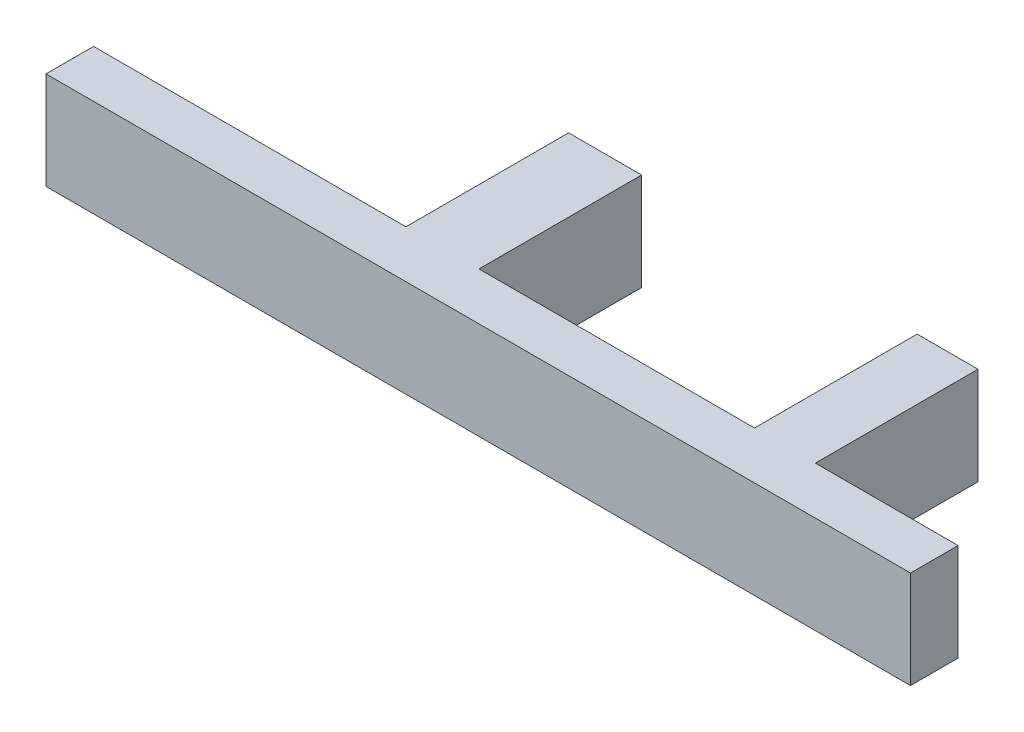
ISO-10303-21;
HEADER;
FILE_DESCRIPTION(('STEP AP214'),'2;1');
FILE_NAME('part.step','',(''),(''),'','','');
FILE_SCHEMA(('AUTOMOTIVE_DESIGN { 1 0 10303 214 1 1 1 1 }'));
ENDSEC;
DATA;
#1=APPLICATION_CONTEXT('core data for automotive mechanical design processes');
#2=APPLICATION_PROTOCOL_DEFINITION('international standard','automotive_design',2000,#1);
#3=PRODUCT_CONTEXT('',#1,'mechanical');
#4=PRODUCT('Part','Part','',(#3));
#5=PRODUCT_RELATED_PRODUCT_CATEGORY('part','',(#4));
#6=PRODUCT_DEFINITION_FORMATION('','',#4);
#7=PRODUCT_DEFINITION_CONTEXT('part definition',#1,'design');
#8=PRODUCT_DEFINITION('design','',#6,#7);
#9=PRODUCT_DEFINITION_SHAPE('','',#8);
#10=(LENGTH_UNIT() NAMED_UNIT(*) SI_UNIT(.MILLI.,.METRE.));
#11=(NAMED_UNIT(*) PLANE_ANGLE_UNIT() SI_UNIT($,.RADIAN.));
#12=(NAMED_UNIT(*) SI_UNIT($,.STERADIAN.) SOLID_ANGLE_UNIT());
#13=UNCERTAINTY_MEASURE_WITH_UNIT(LENGTH_MEASURE(1.E-05),#10,'distance_accuracy_value','');
#14=(GEOMETRIC_REPRESENTATION_CONTEXT(3) GLOBAL_UNCERTAINTY_ASSIGNED_CONTEXT((#13)) GLOBAL_UNIT_ASSIGNED_CONTEXT((#10,
#11,#12)) REPRESENTATION_CONTEXT('',''));
#15=CARTESIAN_POINT('',(0.,0.,0.));
#16=DIRECTION('',(0.,0.,1.));
#17=DIRECTION('',(1.,0.,0.));
#18=AXIS2_PLACEMENT_3D('',#15,#16,#17);
#19=CARTESIAN_POINT('',(12.0137766691168,1.,-14.303194592097));
#20=DIRECTION('',(0.,0.,1.));
#21=DIRECTION('',(1.,0.,0.));
#22=AXIS2_PLACEMENT_3D('',#19,#20,#21);
#23=PLANE('',#22);
#24=DIRECTION('',(-1.,0.,0.));
#25=VECTOR('',#24,1.);
#26=CARTESIAN_POINT('',(12.0137766691168,0.,-14.303194592097));
#27=LINE('',#26,#25);
#28=CARTESIAN_POINT('',(12.0137766691168,0.,-14.303194592097));
#29=VERTEX_POINT('',#28);
#30=CARTESIAN_POINT('',(10.5497617712563,0.,-14.303194592097));
#31=VERTEX_POINT('',#30);
#32=EDGE_CURVE('E11',#29,#31,#27,.T.);
#33=ORIENTED_EDGE('',*,*,#32,.T.);
#34=DIRECTION('',(0.,-1.,0.));
#35=VECTOR('',#34,1.);
#36=CARTESIAN_POINT('',(10.5497617712563,1.,-14.303194592097));
#37=LINE('',#36,#35);
#38=CARTESIAN_POINT('',(10.5497617712563,1.,-14.303194592097));
#39=VERTEX_POINT('',#38);
#40=EDGE_CURVE('E255',#39,#31,#37,.T.);
#41=ORIENTED_EDGE('',*,*,#40,.F.);
#42=DIRECTION('',(-1.,0.,0.));
#43=VECTOR('',#42,1.);
#44=CARTESIAN_POINT('',(12.0137766691168,1.,-14.303194592097));
#45=LINE('',#44,#43);
#46=CARTESIAN_POINT('',(12.0137766691168,1.,-14.303194592097));
#47=VERTEX_POINT('',#46);
#48=EDGE_CURVE('E43',#47,#39,#45,.T.);
#49=ORIENTED_EDGE('',*,*,#48,.F.);
#50=DIRECTION('',(0.,-1.,0.));
#51=VECTOR('',#50,1.);
#52=CARTESIAN_POINT('',(12.0137766691168,1.,-14.303194592097));
#53=LINE('',#52,#51);
#54=EDGE_CURVE('E167',#47,#29,#53,.T.);
#55=ORIENTED_EDGE('',*,*,#54,.T.);
#56=EDGE_LOOP('',(#33,#41,#49,#55));
#57=FACE_BOUND('',#56,.T.);
#58=ADVANCED_FACE('F39',(#57),#23,.F.);
#59=CARTESIAN_POINT('',(10.5497617712563,1.,-14.303194592097));
#60=DIRECTION('',(-1.,0.,0.));
#61=DIRECTION('',(0.,0.,1.));
#62=AXIS2_PLACEMENT_3D('',#59,#60,#61);
#63=PLANE('',#62);
#64=DIRECTION('',(0.,0.,-1.));
#65=VECTOR('',#64,1.);
#66=CARTESIAN_POINT('',(10.5497617712563,0.,-14.303194592097));
#67=LINE('',#66,#65);
#68=CARTESIAN_POINT('',(10.5497617712563,0.,-15.9714906384962));
#69=VERTEX_POINT('',#68);
#70=EDGE_CURVE('E49',#31,#69,#67,.T.);
#71=ORIENTED_EDGE('',*,*,#70,.T.);
#72=DIRECTION('',(0.,-1.,0.));
#73=VECTOR('',#72,1.);
#74=CARTESIAN_POINT('',(10.5497617712563,1.,-15.9714906384962));
#75=LINE('',#74,#73);
#76=CARTESIAN_POINT('',(10.5497617712563,1.,-15.9714906384962));
#77=VERTEX_POINT('',#76);
#78=EDGE_CURVE('E143',#77,#69,#75,.T.);
#79=ORIENTED_EDGE('',*,*,#78,.F.);
#80=DIRECTION('',(0.,0.,-1.));
#81=VECTOR('',#80,1.);
#82=CARTESIAN_POINT('',(10.5497617712563,1.,-14.303194592097));
#83=LINE('',#82,#81);
#84=EDGE_CURVE('E97',#39,#77,#83,.T.);
#85=ORIENTED_EDGE('',*,*,#84,.F.);
#86=ORIENTED_EDGE('',*,*,#40,.T.);
#87=EDGE_LOOP('',(#71,#79,#85,#86));
#88=FACE_BOUND('',#87,.T.);
#89=ADVANCED_FACE('F256',(#88),#63,.F.);
#90=CARTESIAN_POINT('',(10.5497617712563,1.,-15.9714906384962));
#91=DIRECTION('',(0.,0.,1.));
#92=DIRECTION('',(1.,0.,0.));
#93=AXIS2_PLACEMENT_3D('',#90,#91,#92);
#94=PLANE('',#93);
#95=DIRECTION('',(-1.,0.,0.));
#96=VECTOR('',#95,1.);
#97=CARTESIAN_POINT('',(10.5497617712563,0.,-15.9714906384962));
#98=LINE('',#97,#96);
#99=CARTESIAN_POINT('',(9.92556937294369,0.,-15.9714906384962));
#100=VERTEX_POINT('',#99);
#101=EDGE_CURVE('E137',#69,#100,#98,.T.);
#102=ORIENTED_EDGE('',*,*,#101,.T.);
#103=DIRECTION('',(0.,-1.,0.));
#104=VECTOR('',#103,1.);
#105=CARTESIAN_POINT('',(9.92556937294369,1.,-15.9714906384962));
#106=LINE('',#105,#104);
#107=CARTESIAN_POINT('',(9.92556937294369,1.,-15.9714906384962));
#108=VERTEX_POINT('',#107);
#109=EDGE_CURVE('E141',#108,#100,#106,.T.);
#110=ORIENTED_EDGE('',*,*,#109,.F.);
#111=DIRECTION('',(-1.,0.,0.));
#112=VECTOR('',#111,1.);
#113=CARTESIAN_POINT('',(10.5497617712563,1.,-15.9714906384962));
#114=LINE('',#113,#112);
#115=EDGE_CURVE('E182',#77,#108,#114,.T.);
#116=ORIENTED_EDGE('',*,*,#115,.F.);
#117=ORIENTED_EDGE('',*,*,#78,.T.);
#118=EDGE_LOOP('',(#102,#110,#116,#117));
#119=FACE_BOUND('',#118,.T.);
#120=ADVANCED_FACE('F139',(#119),#94,.F.);
#121=CARTESIAN_POINT('',(9.92556937294369,1.,-15.9714906384962));
#122=DIRECTION('',(1.,0.,0.));
#123=DIRECTION('',(0.,0.,-1.));
#124=AXIS2_PLACEMENT_3D('',#121,#122,#123);
#125=PLANE('',#124);
#126=DIRECTION('',(0.,0.,1.));
#127=VECTOR('',#126,1.);
#128=CARTESIAN_POINT('',(9.92556937294369,0.,-15.9714906384962));
#129=LINE('',#128,#127);
#130=CARTESIAN_POINT('',(9.92556937294369,0.,-14.303194592097));
#131=VERTEX_POINT('',#130);
#132=EDGE_CURVE('E145',#100,#131,#129,.T.);
#133=ORIENTED_EDGE('',*,*,#132,.T.);
#134=DIRECTION('',(0.,-1.,0.));
#135=VECTOR('',#134,1.);
#136=CARTESIAN_POINT('',(9.92556937294369,1.,-14.303194592097));
#137=LINE('',#136,#135);
#138=CARTESIAN_POINT('',(9.92556937294369,1.,-14.303194592097));
#139=VERTEX_POINT('',#138);
#140=EDGE_CURVE('E152',#139,#131,#137,.T.);
#141=ORIENTED_EDGE('',*,*,#140,.F.);
#142=DIRECTION('',(0.,0.,1.));
#143=VECTOR('',#142,1.);
#144=CARTESIAN_POINT('',(9.92556937294369,1.,-15.9714906384962));
#145=LINE('',#144,#143);
#146=EDGE_CURVE('E151',#108,#139,#145,.T.);
#147=ORIENTED_EDGE('',*,*,#146,.F.);
#148=ORIENTED_EDGE('',*,*,#109,.T.);
#149=EDGE_LOOP('',(#133,#141,#147,#148));
#150=FACE_BOUND('',#149,.T.);
#151=ADVANCED_FACE('F148',(#150),#125,.F.);
#152=CARTESIAN_POINT('',(9.92556937294369,1.,-14.303194592097));
#153=DIRECTION('',(0.,0.,1.));
#154=DIRECTION('',(1.,0.,0.));
#155=AXIS2_PLACEMENT_3D('',#152,#153,#154);
#156=PLANE('',#155);
#157=DIRECTION('',(-1.,0.,0.));
#158=VECTOR('',#157,1.);
#159=CARTESIAN_POINT('',(9.92556937294369,0.,-14.303194592097));
#160=LINE('',#159,#158);
#161=CARTESIAN_POINT('',(7.09968015149203,0.,-14.303194592097));
#162=VERTEX_POINT('',#161);
#163=EDGE_CURVE('E157',#131,#162,#160,.T.);
#164=ORIENTED_EDGE('',*,*,#163,.T.);
#165=DIRECTION('',(0.,-1.,0.));
#166=VECTOR('',#165,1.);
#167=CARTESIAN_POINT('',(7.09968015149203,1.,-14.303194592097));
#168=LINE('',#167,#166);
#169=CARTESIAN_POINT('',(7.09968015149203,1.,-14.303194592097));
#170=VERTEX_POINT('',#169);
#171=EDGE_CURVE('E207',#170,#162,#168,.T.);
#172=ORIENTED_EDGE('',*,*,#171,.F.);
#173=DIRECTION('',(-1.,0.,0.));
#174=VECTOR('',#173,1.);
#175=CARTESIAN_POINT('',(9.92556937294369,1.,-14.303194592097));
#176=LINE('',#175,#174);
#177=EDGE_CURVE('E179',#139,#170,#176,.T.);
#178=ORIENTED_EDGE('',*,*,#177,.F.);
#179=ORIENTED_EDGE('',*,*,#140,.T.);
#180=EDGE_LOOP('',(#164,#172,#178,#179));
#181=FACE_BOUND('',#180,.T.);
#182=ADVANCED_FACE('F250',(#181),#156,.F.);
#183=CARTESIAN_POINT('',(7.09968015149203,1.,-14.303194592097));
#184=DIRECTION('',(-1.,0.,0.));
#185=DIRECTION('',(0.,0.,1.));
#186=AXIS2_PLACEMENT_3D('',#183,#184,#185);
#187=PLANE('',#186);
#188=DIRECTION('',(0.,0.,-1.));
#189=VECTOR('',#188,1.);
#190=CARTESIAN_POINT('',(7.09968015149203,0.,-14.303194592097));
#191=LINE('',#190,#189);
#192=CARTESIAN_POINT('',(7.09968015149203,0.,-15.9714906384962));
#193=VERTEX_POINT('',#192);
#194=EDGE_CURVE('E159',#162,#193,#191,.T.);
#195=ORIENTED_EDGE('',*,*,#194,.T.);
#196=DIRECTION('',(0.,-1.,0.));
#197=VECTOR('',#196,1.);
#198=CARTESIAN_POINT('',(7.09968015149203,1.,-15.9714906384962));
#199=LINE('',#198,#197);
#200=CARTESIAN_POINT('',(7.09968015149203,1.,-15.9714906384962));
#201=VERTEX_POINT('',#200);
#202=EDGE_CURVE('E204',#201,#193,#199,.T.);
#203=ORIENTED_EDGE('',*,*,#202,.F.);
#204=DIRECTION('',(0.,0.,-1.));
#205=VECTOR('',#204,1.);
#206=CARTESIAN_POINT('',(7.09968015149203,1.,-14.303194592097));
#207=LINE('',#206,#205);
#208=EDGE_CURVE('E177',#170,#201,#207,.T.);
#209=ORIENTED_EDGE('',*,*,#208,.F.);
#210=ORIENTED_EDGE('',*,*,#171,.T.);
#211=EDGE_LOOP('',(#195,#203,#209,#210));
#212=FACE_BOUND('',#211,.T.);
#213=ADVANCED_FACE('F202',(#212),#187,.F.);
#214=CARTESIAN_POINT('',(7.09968015149203,1.,-15.9714906384962));
#215=DIRECTION('',(0.,0.,1.));
#216=DIRECTION('',(1.,0.,0.));
#217=AXIS2_PLACEMENT_3D('',#214,#215,#216);
#218=PLANE('',#217);
#219=DIRECTION('',(-1.,0.,0.));
#220=VECTOR('',#219,1.);
#221=CARTESIAN_POINT('',(7.09968015149203,0.,-15.9714906384962));
#222=LINE('',#221,#220);
#223=CARTESIAN_POINT('',(6.35064927351689,0.,-15.9714906384962));
#224=VERTEX_POINT('',#223);
#225=EDGE_CURVE('E197',#193,#224,#222,.T.);
#226=ORIENTED_EDGE('',*,*,#225,.T.);
#227=DIRECTION('',(0.,-1.,0.));
#228=VECTOR('',#227,1.);
#229=CARTESIAN_POINT('',(6.35064927351689,1.,-15.9714906384962));
#230=LINE('',#229,#228);
#231=CARTESIAN_POINT('',(6.35064927351689,1.,-15.9714906384962));
#232=VERTEX_POINT('',#231);
#233=EDGE_CURVE('E213',#232,#224,#230,.T.);
#234=ORIENTED_EDGE('',*,*,#233,.F.);
#235=DIRECTION('',(-1.,0.,0.));
#236=VECTOR('',#235,1.);
#237=CARTESIAN_POINT('',(7.09968015149203,1.,-15.9714906384962));
#238=LINE('',#237,#236);
#239=EDGE_CURVE('E175',#201,#232,#238,.T.);
#240=ORIENTED_EDGE('',*,*,#239,.F.);
#241=ORIENTED_EDGE('',*,*,#202,.T.);
#242=EDGE_LOOP('',(#226,#234,#240,#241));
#243=FACE_BOUND('',#242,.T.);
#244=ADVANCED_FACE('F210',(#243),#218,.F.);
#245=CARTESIAN_POINT('',(6.35064927351689,1.,-15.9714906384962));
#246=DIRECTION('',(1.,0.,0.));
#247=DIRECTION('',(0.,0.,-1.));
#248=AXIS2_PLACEMENT_3D('',#245,#246,#247);
#249=PLANE('',#248);
#250=DIRECTION('',(0.,0.,1.));
#251=VECTOR('',#250,1.);
#252=CARTESIAN_POINT('',(6.35064927351689,0.,-15.9714906384962));
#253=LINE('',#252,#251);
#254=CARTESIAN_POINT('',(6.35064927351689,0.,-14.303194592097));
#255=VERTEX_POINT('',#254);
#256=EDGE_CURVE('E195',#224,#255,#253,.T.);
#257=ORIENTED_EDGE('',*,*,#256,.T.);
#258=DIRECTION('',(0.,-1.,0.));
#259=VECTOR('',#258,1.);
#260=CARTESIAN_POINT('',(6.35064927351689,1.,-14.303194592097));
#261=LINE('',#260,#259);
#262=CARTESIAN_POINT('',(6.35064927351689,1.,-14.303194592097));
#263=VERTEX_POINT('',#262);
#264=EDGE_CURVE('E223',#263,#255,#261,.T.);
#265=ORIENTED_EDGE('',*,*,#264,.F.);
#266=DIRECTION('',(0.,0.,1.));
#267=VECTOR('',#266,1.);
#268=CARTESIAN_POINT('',(6.35064927351689,1.,-15.9714906384962));
#269=LINE('',#268,#267);
#270=EDGE_CURVE('E173',#232,#263,#269,.T.);
#271=ORIENTED_EDGE('',*,*,#270,.F.);
#272=ORIENTED_EDGE('',*,*,#233,.T.);
#273=EDGE_LOOP('',(#257,#265,#271,#272));
#274=FACE_BOUND('',#273,.T.);
#275=ADVANCED_FACE('F221',(#274),#249,.F.);
#276=CARTESIAN_POINT('',(6.35064927351689,1.,-14.303194592097));
#277=DIRECTION('',(0.,0.,1.));
#278=DIRECTION('',(1.,0.,0.));
#279=AXIS2_PLACEMENT_3D('',#276,#277,#278);
#280=PLANE('',#279);
#281=DIRECTION('',(-1.,0.,0.));
#282=VECTOR('',#281,1.);
#283=CARTESIAN_POINT('',(6.35064927351689,0.,-14.303194592097));
#284=LINE('',#283,#282);
#285=CARTESIAN_POINT('',(3.14682612178813,0.,-14.303194592097));
#286=VERTEX_POINT('',#285);
#287=EDGE_CURVE('E193',#255,#286,#284,.T.);
#288=ORIENTED_EDGE('',*,*,#287,.T.);
#289=DIRECTION('',(0.,-1.,0.));
#290=VECTOR('',#289,1.);
#291=CARTESIAN_POINT('',(3.14682612178813,1.,-14.303194592097));
#292=LINE('',#291,#290);
#293=CARTESIAN_POINT('',(3.14682612178813,1.,-14.303194592097));
#294=VERTEX_POINT('',#293);
#295=EDGE_CURVE('E229',#294,#286,#292,.T.);
#296=ORIENTED_EDGE('',*,*,#295,.F.);
#297=DIRECTION('',(-1.,0.,0.));
#298=VECTOR('',#297,1.);
#299=CARTESIAN_POINT('',(6.35064927351689,1.,-14.303194592097));
#300=LINE('',#299,#298);
#301=EDGE_CURVE('E171',#263,#294,#300,.T.);
#302=ORIENTED_EDGE('',*,*,#301,.F.);
#303=ORIENTED_EDGE('',*,*,#264,.T.);
#304=EDGE_LOOP('',(#288,#296,#302,#303));
#305=FACE_BOUND('',#304,.T.);
#306=ADVANCED_FACE('F226',(#305),#280,.F.);
#307=CARTESIAN_POINT('',(3.14682612178813,1.,-14.303194592097));
#308=DIRECTION('',(1.,0.,0.));
#309=DIRECTION('',(0.,0.,-1.));
#310=AXIS2_PLACEMENT_3D('',#307,#308,#309);
#311=PLANE('',#310);
#312=DIRECTION('',(0.,0.,1.));
#313=VECTOR('',#312,1.);
#314=CARTESIAN_POINT('',(3.14682612178813,0.,-14.303194592097));
#315=LINE('',#314,#313);
#316=CARTESIAN_POINT('',(3.14682612178813,0.,-13.8151896261435));
#317=VERTEX_POINT('',#316);
#318=EDGE_CURVE('E187',#286,#317,#315,.T.);
#319=ORIENTED_EDGE('',*,*,#318,.T.);
#320=DIRECTION('',(0.,-1.,0.));
#321=VECTOR('',#320,1.);
#322=CARTESIAN_POINT('',(3.14682612178813,1.,-13.8151896261435));
#323=LINE('',#322,#321);
#324=CARTESIAN_POINT('',(3.14682612178813,1.,-13.8151896261435));
#325=VERTEX_POINT('',#324);
#326=EDGE_CURVE('E231',#325,#317,#323,.T.);
#327=ORIENTED_EDGE('',*,*,#326,.F.);
#328=DIRECTION('',(0.,0.,1.));
#329=VECTOR('',#328,1.);
#330=CARTESIAN_POINT('',(3.14682612178813,1.,-14.303194592097));
#331=LINE('',#330,#329);
#332=EDGE_CURVE('E169',#294,#325,#331,.T.);
#333=ORIENTED_EDGE('',*,*,#332,.F.);
#334=ORIENTED_EDGE('',*,*,#295,.T.);
#335=EDGE_LOOP('',(#319,#327,#333,#334));
#336=FACE_BOUND('',#335,.T.);
#337=ADVANCED_FACE('F247',(#336),#311,.F.);
#338=CARTESIAN_POINT('',(3.14682612178813,1.,-13.8151896261435));
#339=DIRECTION('',(0.,0.,-1.));
#340=DIRECTION('',(-1.,0.,0.));
#341=AXIS2_PLACEMENT_3D('',#338,#339,#340);
#342=PLANE('',#341);
#343=DIRECTION('',(1.,0.,0.));
#344=VECTOR('',#343,1.);
#345=CARTESIAN_POINT('',(3.14682612178813,0.,-13.8151896261435));
#346=LINE('',#345,#344);
#347=CARTESIAN_POINT('',(12.0137766691168,0.,-13.8151896261435));
#348=VERTEX_POINT('',#347);
#349=EDGE_CURVE('E185',#317,#348,#346,.T.);
#350=ORIENTED_EDGE('',*,*,#349,.T.);
#351=DIRECTION('',(0.,-1.,0.));
#352=VECTOR('',#351,1.);
#353=CARTESIAN_POINT('',(12.0137766691168,1.,-13.8151896261435));
#354=LINE('',#353,#352);
#355=CARTESIAN_POINT('',(12.0137766691168,1.,-13.8151896261435));
#356=VERTEX_POINT('',#355);
#357=EDGE_CURVE('E236',#356,#348,#354,.T.);
#358=ORIENTED_EDGE('',*,*,#357,.F.);
#359=DIRECTION('',(1.,0.,0.));
#360=VECTOR('',#359,1.);
#361=CARTESIAN_POINT('',(3.14682612178813,1.,-13.8151896261435));
#362=LINE('',#361,#360);
#363=EDGE_CURVE('E166',#325,#356,#362,.T.);
#364=ORIENTED_EDGE('',*,*,#363,.F.);
#365=ORIENTED_EDGE('',*,*,#326,.T.);
#366=EDGE_LOOP('',(#350,#358,#364,#365));
#367=FACE_BOUND('',#366,.T.);
#368=ADVANCED_FACE('F242',(#367),#342,.F.);
#369=CARTESIAN_POINT('',(12.0137766691168,1.,-13.8151896261435));
#370=DIRECTION('',(-1.,0.,0.));
#371=DIRECTION('',(0.,0.,1.));
#372=AXIS2_PLACEMENT_3D('',#369,#370,#371);
#373=PLANE('',#372);
#374=DIRECTION('',(0.,0.,-1.));
#375=VECTOR('',#374,1.);
#376=CARTESIAN_POINT('',(12.0137766691168,0.,-13.8151896261435));
#377=LINE('',#376,#375);
#378=EDGE_CURVE('E108',#348,#29,#377,.T.);
#379=ORIENTED_EDGE('',*,*,#378,.T.);
#380=ORIENTED_EDGE('',*,*,#54,.F.);
#381=DIRECTION('',(0.,0.,-1.));
#382=VECTOR('',#381,1.);
#383=CARTESIAN_POINT('',(12.0137766691168,1.,-13.8151896261435));
#384=LINE('',#383,#382);
#385=EDGE_CURVE('E164',#356,#47,#384,.T.);
#386=ORIENTED_EDGE('',*,*,#385,.F.);
#387=ORIENTED_EDGE('',*,*,#357,.T.);
#388=EDGE_LOOP('',(#379,#380,#386,#387));
#389=FACE_BOUND('',#388,.T.);
#390=ADVANCED_FACE('F283',(#389),#373,.F.);
#391=CARTESIAN_POINT('',(0.,1.,0.));
#392=DIRECTION('',(0.,-1.,0.));
#393=DIRECTION('',(0.,0.,-1.));
#394=AXIS2_PLACEMENT_3D('',#391,#392,#393);
#395=PLANE('',#394);
#396=ORIENTED_EDGE('',*,*,#48,.T.);
#397=ORIENTED_EDGE('',*,*,#84,.T.);
#398=ORIENTED_EDGE('',*,*,#115,.T.);
#399=ORIENTED_EDGE('',*,*,#146,.T.);
#400=ORIENTED_EDGE('',*,*,#177,.T.);
#401=ORIENTED_EDGE('',*,*,#208,.T.);
#402=ORIENTED_EDGE('',*,*,#239,.T.);
#403=ORIENTED_EDGE('',*,*,#270,.T.);
#404=ORIENTED_EDGE('',*,*,#301,.T.);
#405=ORIENTED_EDGE('',*,*,#332,.T.);
#406=ORIENTED_EDGE('',*,*,#363,.T.);
#407=ORIENTED_EDGE('',*,*,#385,.T.);
#408=EDGE_LOOP('',(#396,#397,#398,#399,#400,#401,#402,#403,#404,#405,#406,#407));
#409=FACE_BOUND('',#408,.T.);
#410=ADVANCED_FACE('F41',(#409),#395,.F.);
#411=CARTESIAN_POINT('',(0.,0.,0.));
#412=DIRECTION('',(0.,-1.,0.));
#413=DIRECTION('',(0.,0.,-1.));
#414=AXIS2_PLACEMENT_3D('',#411,#412,#413);
#415=PLANE('',#414);
#416=ORIENTED_EDGE('',*,*,#32,.F.);
#417=ORIENTED_EDGE('',*,*,#378,.F.);
#418=ORIENTED_EDGE('',*,*,#349,.F.);
#419=ORIENTED_EDGE('',*,*,#318,.F.);
#420=ORIENTED_EDGE('',*,*,#287,.F.);
#421=ORIENTED_EDGE('',*,*,#256,.F.);
#422=ORIENTED_EDGE('',*,*,#225,.F.);
#423=ORIENTED_EDGE('',*,*,#194,.F.);
#424=ORIENTED_EDGE('',*,*,#163,.F.);
#425=ORIENTED_EDGE('',*,*,#132,.F.);
#426=ORIENTED_EDGE('',*,*,#101,.F.);
#427=ORIENTED_EDGE('',*,*,#70,.F.);
#428=EDGE_LOOP('',(#416,#417,#418,#419,#420,#421,#422,#423,#424,#425,#426,#427));
#429=FACE_BOUND('',#428,.T.);
#430=ADVANCED_FACE('F155',(#429),#415,.T.);
#431=CLOSED_SHELL('',(#58,#89,#120,#151,#182,#213,#244,#275,#306,#337,#368,#390,#410,#430));
#432=MANIFOLD_SOLID_BREP('B2',#431);
#433=ADVANCED_BREP_SHAPE_REPRESENTATION('',(#18,#432),#14);
#434=SHAPE_DEFINITION_REPRESENTATION(#9,#433);
ENDSEC;
END-ISO-10303-21;
